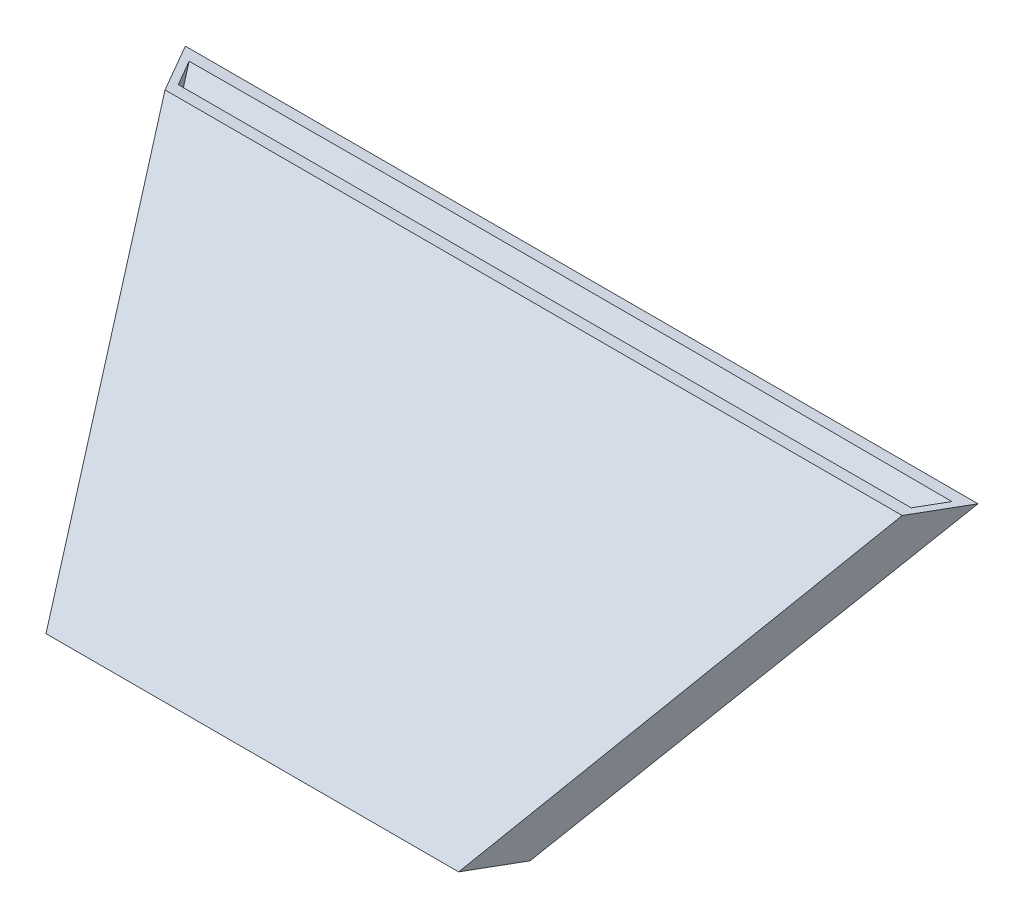
ISO-10303-21;
HEADER;
FILE_DESCRIPTION(('STEP AP214'),'2;1');
FILE_NAME('part.step','',(''),(''),'','','');
FILE_SCHEMA(('AUTOMOTIVE_DESIGN { 1 0 10303 214 1 1 1 1 }'));
ENDSEC;
DATA;
#1=APPLICATION_CONTEXT('core data for automotive mechanical design processes');
#2=APPLICATION_PROTOCOL_DEFINITION('international standard','automotive_design',2000,#1);
#3=PRODUCT_CONTEXT('',#1,'mechanical');
#4=PRODUCT('Part','Part','',(#3));
#5=PRODUCT_RELATED_PRODUCT_CATEGORY('part','',(#4));
#6=PRODUCT_DEFINITION_FORMATION('','',#4);
#7=PRODUCT_DEFINITION_CONTEXT('part definition',#1,'design');
#8=PRODUCT_DEFINITION('design','',#6,#7);
#9=PRODUCT_DEFINITION_SHAPE('','',#8);
#10=(LENGTH_UNIT() NAMED_UNIT(*) SI_UNIT(.MILLI.,.METRE.));
#11=(NAMED_UNIT(*) PLANE_ANGLE_UNIT() SI_UNIT($,.RADIAN.));
#12=(NAMED_UNIT(*) SI_UNIT($,.STERADIAN.) SOLID_ANGLE_UNIT());
#13=UNCERTAINTY_MEASURE_WITH_UNIT(LENGTH_MEASURE(1.E-05),#10,'distance_accuracy_value','');
#14=(GEOMETRIC_REPRESENTATION_CONTEXT(3) GLOBAL_UNCERTAINTY_ASSIGNED_CONTEXT((#13)) GLOBAL_UNIT_ASSIGNED_CONTEXT((#10,
#11,#12)) REPRESENTATION_CONTEXT('',''));
#15=CARTESIAN_POINT('',(0.,0.,0.));
#16=DIRECTION('',(0.,0.,1.));
#17=DIRECTION('',(1.,0.,0.));
#18=AXIS2_PLACEMENT_3D('',#15,#16,#17);
#19=CARTESIAN_POINT('',(0.,336.67,0.));
#20=DIRECTION('',(0.,-1.,0.));
#21=DIRECTION('',(0.,0.,-1.));
#22=AXIS2_PLACEMENT_3D('',#19,#20,#21);
#23=PLANE('',#22);
#24=DIRECTION('',(0.5,0.,0.866025403784439));
#25=VECTOR('',#24,1.);
#26=CARTESIAN_POINT('',(-812.185,336.67,-318.914360830776));
#27=LINE('',#26,#25);
#28=CARTESIAN_POINT('',(-849.685,336.67,-383.866266114609));
#29=VERTEX_POINT('',#28);
#30=CARTESIAN_POINT('',(-812.185,336.67,-318.914360830776));
#31=VERTEX_POINT('',#30);
#32=EDGE_CURVE('E195',#29,#31,#27,.T.);
#33=ORIENTED_EDGE('',*,*,#32,.T.);
#34=DIRECTION('',(1.,0.,0.));
#35=VECTOR('',#34,1.);
#36=CARTESIAN_POINT('',(-812.185,336.67,-318.914360830776));
#37=LINE('',#36,#35);
#38=CARTESIAN_POINT('',(183.945,336.67,-318.914360830776));
#39=VERTEX_POINT('',#38);
#40=EDGE_CURVE('E198',#31,#39,#37,.T.);
#41=ORIENTED_EDGE('',*,*,#40,.T.);
#42=DIRECTION('',(0.5,0.,-0.866025403784439));
#43=VECTOR('',#42,1.);
#44=CARTESIAN_POINT('',(221.445,336.67,-383.866266114609));
#45=LINE('',#44,#43);
#46=CARTESIAN_POINT('',(221.445,336.67,-383.866266114609));
#47=VERTEX_POINT('',#46);
#48=EDGE_CURVE('E202',#39,#47,#45,.T.);
#49=ORIENTED_EDGE('',*,*,#48,.T.);
#50=DIRECTION('',(-1.,0.,0.));
#51=VECTOR('',#50,1.);
#52=CARTESIAN_POINT('',(-849.685,336.67,-383.866266114609));
#53=LINE('',#52,#51);
#54=EDGE_CURVE('E238',#47,#29,#53,.T.);
#55=ORIENTED_EDGE('',*,*,#54,.T.);
#56=EDGE_LOOP('',(#33,#41,#49,#55));
#57=FACE_BOUND('',#56,.T.);
#58=DIRECTION('',(0.5,0.,0.866025403784438));
#59=VECTOR('',#58,1.);
#60=CARTESIAN_POINT('',(-462.384525975255,336.67,266.957830540931));
#61=LINE('',#60,#59);
#62=CARTESIAN_POINT('',(-829.434203941642,336.67,-368.790860598645));
#63=VERTEX_POINT('',#62);
#64=CARTESIAN_POINT('',(-809.345411093207,336.67,-333.99605072243));
#65=VERTEX_POINT('',#64);
#66=EDGE_CURVE('E381',#63,#65,#61,.T.);
#67=ORIENTED_EDGE('',*,*,#66,.F.);
#68=CARTESIAN_POINT('',(201.194203941642,336.67,-368.790860598645));
#69=CARTESIAN_POINT('',(177.767622527672,336.67,-368.927560260811));
#70=CARTESIAN_POINT('',(154.340988191036,336.67,-369.055227186869));
#71=CARTESIAN_POINT('',(107.48762626407,336.67,-369.292150354651));
#72=CARTESIAN_POINT('',(84.0608986737395,336.67,-369.401406596216));
#73=CARTESIAN_POINT('',(37.2073662340033,336.67,-369.601163167737));
#74=CARTESIAN_POINT('',(13.7805613846082,336.67,-369.691663500094));
#75=CARTESIAN_POINT('',(-33.0731126815192,336.67,-369.853826659134));
#76=CARTESIAN_POINT('',(-56.4999818982513,336.67,-369.925489485847));
#77=CARTESIAN_POINT('',(-126.780666880352,336.67,-370.112247978965));
#78=CARTESIAN_POINT('',(-173.634562051957,336.67,-370.199113667192));
#79=CARTESIAN_POINT('',(-243.915459219402,336.67,-370.273490536471));
#80=CARTESIAN_POINT('',(-267.342436137663,336.67,-370.28896254792));
#81=CARTESIAN_POINT('',(-314.196396276341,336.67,-370.301316174199));
#82=CARTESIAN_POINT('',(-337.623379496757,336.67,-370.298197788283));
#83=CARTESIAN_POINT('',(-400.082568879104,336.67,-370.265095742492));
#84=CARTESIAN_POINT('',(-439.114767294266,336.67,-370.218600212694));
#85=CARTESIAN_POINT('',(-517.179071623277,336.67,-370.073607070972));
#86=CARTESIAN_POINT('',(-556.211177537117,336.67,-369.975109454431));
#87=CARTESIAN_POINT('',(-614.759221727425,336.67,-369.788113179925));
#88=CARTESIAN_POINT('',(-634.275224432825,336.67,-369.719239414662));
#89=CARTESIAN_POINT('',(-673.307179853951,336.67,-369.568445320019));
#90=CARTESIAN_POINT('',(-692.823132569676,336.67,-369.486524990566));
#91=CARTESIAN_POINT('',(-731.854977619463,336.67,-369.309720051469));
#92=CARTESIAN_POINT('',(-751.37086995353,336.67,-369.214835442835));
#93=CARTESIAN_POINT('',(-790.402588367779,336.67,-369.012336587714));
#94=CARTESIAN_POINT('',(-809.918414447963,336.67,-368.904722341381));
#95=CARTESIAN_POINT('',(-829.434203941642,336.67,-368.790860598645));
#96=B_SPLINE_CURVE_WITH_KNOTS('',3,(#68,#69,#70,#71,#72,#73,#74,#75,#76,#77,#78,#79,#80,#81,#82,
#83,#84,#85,#86,#87,#88,#89,#90,#91,#92,#93,#94,#95),.UNSPECIFIED.,.F.,.F.,(4,2,2,2,2,2,2,2,2,2,
2,2,2,4),(0.,70.2809392750129,140.56187915507,210.842810036164,281.123740803581,421.68559611537,
491.966536535892,562.2474797771,679.344122455269,796.440775530799,854.989144601206,
913.537513996576,972.085878827586,1030.63424294677),.UNSPECIFIED.);
#97=CARTESIAN_POINT('',(201.194203941642,336.67,-368.790860598645));
#98=VERTEX_POINT('',#97);
#99=EDGE_CURVE('E132',#98,#63,#96,.T.);
#100=ORIENTED_EDGE('',*,*,#99,.F.);
#101=DIRECTION('',(0.5,0.,-0.866025403784438));
#102=VECTOR('',#101,1.);
#103=CARTESIAN_POINT('',(-8.79547402474481,336.67,-5.07806929583678));
#104=LINE('',#103,#102);
#105=CARTESIAN_POINT('',(181.105411093207,336.67,-333.99605072243));
#106=VERTEX_POINT('',#105);
#107=EDGE_CURVE('E380',#106,#98,#104,.T.);
#108=ORIENTED_EDGE('',*,*,#107,.F.);
#109=DIRECTION('',(1.,0.,0.));
#110=VECTOR('',#109,1.);
#111=CARTESIAN_POINT('',(0.,336.67,-333.99605072243));
#112=LINE('',#111,#110);
#113=EDGE_CURVE('E133',#65,#106,#112,.T.);
#114=ORIENTED_EDGE('',*,*,#113,.F.);
#115=EDGE_LOOP('',(#67,#100,#108,#114));
#116=FACE_BOUND('',#115,.T.);
#117=ADVANCED_FACE('F50',(#57,#116),#23,.F.);
#118=CARTESIAN_POINT('',(-314.12,0.,619.065639169224));
#119=DIRECTION('',(0.,1.,0.));
#120=DIRECTION('',(0.,0.,1.));
#121=AXIS2_PLACEMENT_3D('',#118,#119,#120);
#122=PLANE('',#121);
#123=DIRECTION('',(0.5,0.,-0.866025403784438));
#124=VECTOR('',#123,1.);
#125=CARTESIAN_POINT('',(-355.25354003448,0.,595.317178757595));
#126=LINE('',#125,#124);
#127=CARTESIAN_POINT('',(-38.1595889067927,0.,46.0943446316787));
#128=VERTEX_POINT('',#127);
#129=CARTESIAN_POINT('',(-17.1460683511006,0.,9.69785938332696));
#130=VERTEX_POINT('',#129);
#131=EDGE_CURVE('E136',#128,#130,#126,.T.);
#132=ORIENTED_EDGE('',*,*,#131,.T.);
#133=CARTESIAN_POINT('',(-17.1460683511006,0.,9.69785938332696));
#134=CARTESIAN_POINT('',(-22.5959345549177,0.,6.91446475709525));
#135=CARTESIAN_POINT('',(-28.08520646531,0.,4.20833848070663));
#136=CARTESIAN_POINT('',(-39.1377001956092,0.,-1.04735906517468));
#137=CARTESIAN_POINT('',(-44.7009165653222,0.,-3.59694179596975));
#138=CARTESIAN_POINT('',(-55.8969425284475,0.,-8.53781214612076));
#139=CARTESIAN_POINT('',(-61.5297484333102,0.,-10.9291081130142));
#140=CARTESIAN_POINT('',(-70.0277258618618,0.,-14.3957770906997));
#141=CARTESIAN_POINT('',(-72.8685008168732,0.,-15.5312829776681));
#142=CARTESIAN_POINT('',(-78.5658425406811,0.,-17.7619609461049));
#143=CARTESIAN_POINT('',(-81.4224093106047,0.,-18.8571330246944));
#144=CARTESIAN_POINT('',(-90.0147625720901,0.,-22.0819476816425));
#145=CARTESIAN_POINT('',(-95.7734291646743,0.,-24.1509813294373));
#146=CARTESIAN_POINT('',(-107.346715300891,0.,-28.1258382717863));
#147=CARTESIAN_POINT('',(-113.161334786217,0.,-30.0316617363938));
#148=CARTESIAN_POINT('',(-124.836610971547,0.,-33.6769718630674));
#149=CARTESIAN_POINT('',(-130.697220200837,0.,-35.4166105012768));
#150=CARTESIAN_POINT('',(-142.465003556135,0.,-38.7305363227231));
#151=CARTESIAN_POINT('',(-148.372177739316,0.,-40.304823302909));
#152=CARTESIAN_POINT('',(-160.228442035433,0.,-43.286758583143));
#153=CARTESIAN_POINT('',(-166.177532192732,0.,-44.6944067067977));
#154=CARTESIAN_POINT('',(-178.112840227048,0.,-47.3423596600115));
#155=CARTESIAN_POINT('',(-184.099058093284,0.,-48.5826645381618));
#156=CARTESIAN_POINT('',(-196.10387832942,0.,-50.8948987347913));
#157=CARTESIAN_POINT('',(-202.122480567271,0.,-51.966828739292));
#158=CARTESIAN_POINT('',(-214.187333246482,0.,-53.9418022987353));
#159=CARTESIAN_POINT('',(-220.233583375859,0.,-54.8448477546089));
#160=CARTESIAN_POINT('',(-229.927212182593,0.,-56.154273862367));
#161=CARTESIAN_POINT('',(-233.567353123389,0.,-56.6148899702799));
#162=CARTESIAN_POINT('',(-240.854901556854,0.,-57.4749098113412));
#163=CARTESIAN_POINT('',(-244.502309086763,0.,-57.8743132299659));
#164=CARTESIAN_POINT('',(-251.803321011183,0.,-58.6118791558135));
#165=CARTESIAN_POINT('',(-255.456925417777,0.,-58.9500415434858));
#166=CARTESIAN_POINT('',(-262.769248516998,0.,-59.5650481879773));
#167=CARTESIAN_POINT('',(-266.427967201953,0.,-59.8418925366685));
#168=CARTESIAN_POINT('',(-277.410384718215,0.,-60.5802444989461));
#169=CARTESIAN_POINT('',(-284.740500546809,0.,-60.9495867434485));
#170=CARTESIAN_POINT('',(-299.409002806994,0.,-61.4424323140075));
#171=CARTESIAN_POINT('',(-306.747389414027,0.,-61.5659303230526));
#172=CARTESIAN_POINT('',(-321.424391525608,0.,-61.5666951912937));
#173=CARTESIAN_POINT('',(-328.763007030538,0.,-61.4439548043461));
#174=CARTESIAN_POINT('',(-343.428616925756,0.,-60.9527226905418));
#175=CARTESIAN_POINT('',(-350.755615211304,0.,-60.5843493804904));
#176=CARTESIAN_POINT('',(-361.733440095958,0.,-59.8476048461677));
#177=CARTESIAN_POINT('',(-365.390667579713,0.,-59.57131938692));
#178=CARTESIAN_POINT('',(-372.700017491556,0.,-58.9574810436383));
#179=CARTESIAN_POINT('',(-376.352139918283,0.,-58.6199281432803));
#180=CARTESIAN_POINT('',(-383.650057167611,0.,-57.8836461768688));
#181=CARTESIAN_POINT('',(-387.295852234254,0.,-57.4849195257866));
#182=CARTESIAN_POINT('',(-394.58023423233,0.,-56.6263051163144));
#183=CARTESIAN_POINT('',(-398.218821167692,0.,-56.1664173912852));
#184=CARTESIAN_POINT('',(-405.487475339594,0.,-55.1856446343803));
#185=CARTESIAN_POINT('',(-409.117543219243,0.,-54.6647643685453));
#186=CARTESIAN_POINT('',(-416.368427907923,0.,-53.5621428792774));
#187=CARTESIAN_POINT('',(-419.98924470149,0.,-52.9804015541819));
#188=CARTESIAN_POINT('',(-427.220201853812,0.,-51.7562403416297));
#189=CARTESIAN_POINT('',(-430.830343355902,0.,-51.1138272142984));
#190=CARTESIAN_POINT('',(-438.039251639207,0.,-49.7683662534019));
#191=CARTESIAN_POINT('',(-441.638018488757,0.,-49.065318784825));
#192=CARTESIAN_POINT('',(-450.988204956945,0.,-47.1569247695161));
#193=CARTESIAN_POINT('',(-456.730055253023,0.,-45.9041801461838));
#194=CARTESIAN_POINT('',(-465.315450153069,0.,-43.9093765575304));
#195=CARTESIAN_POINT('',(-468.172587368855,0.,-43.2251864044171));
#196=CARTESIAN_POINT('',(-473.877369914811,0.,-41.8182782644751));
#197=CARTESIAN_POINT('',(-476.725015233826,0.,-41.0955602323842));
#198=CARTESIAN_POINT('',(-485.252484746578,0.,-38.8699242392712));
#199=CARTESIAN_POINT('',(-490.91738490881,0.,-37.3093983554834));
#200=CARTESIAN_POINT('',(-502.202608435763,0.,-34.0359618578261));
#201=CARTESIAN_POINT('',(-507.822933997201,0.,-32.3230588048438));
#202=CARTESIAN_POINT('',(-519.015002675124,0.,-28.745747016958));
#203=CARTESIAN_POINT('',(-524.586747029259,0.,-26.8813421542632));
#204=CARTESIAN_POINT('',(-535.677470049641,0.,-23.0024780909464));
#205=CARTESIAN_POINT('',(-541.196451790307,0.,-20.9880276941901));
#206=CARTESIAN_POINT('',(-549.43234173794,0.,-17.8546488702972));
#207=CARTESIAN_POINT('',(-552.170605656876,0.,-16.79154554309));
#208=CARTESIAN_POINT('',(-557.632429012831,0.,-14.6282141166534));
#209=CARTESIAN_POINT('',(-560.355988449615,0.,-13.5279860168299));
#210=CARTESIAN_POINT('',(-568.504184848367,0.,-10.1718786246856));
#211=CARTESIAN_POINT('',(-573.90614367488,0.,-7.86065089863976));
#212=CARTESIAN_POINT('',(-584.645814811389,0.,-3.09230805861351));
#213=CARTESIAN_POINT('',(-589.983521019854,0.,-0.635179219040813));
#214=CARTESIAN_POINT('',(-600.590914790585,0.,4.42348924505039));
#215=CARTESIAN_POINT('',(-605.860593357967,0.,7.02504773039029));
#216=CARTESIAN_POINT('',(-611.0939316489,0.,9.69785938332692));
#217=B_SPLINE_CURVE_WITH_KNOTS('',3,(#133,#134,#135,#136,#137,#138,#139,#140,#141,#142,#143,
#144,#145,#146,#147,#148,#149,#150,#151,#152,#153,#154,#155,#156,#157,#158,#159,#160,#161,#162,
#163,#164,#165,#166,#167,#168,#169,#170,#171,#172,#173,#174,#175,#176,#177,#178,#179,#180,#181,
#182,#183,#184,#185,#186,#187,#188,#189,#190,#191,#192,#193,#194,#195,#196,#197,#198,#199,#200,
#201,#202,#203,#204,#205,#206,#207,#208,#209,#210,#211,#212,#213,#214,#215,#216),.UNSPECIFIED.,
.F.,.F.,(4,2,2,2,2,2,2,2,2,2,2,2,2,2,2,2,2,2,2,2,2,2,2,2,2,2,2,2,2,2,2,2,2,2,2,2,2,2,2,2,2,4),
(0.,18.3578001638368,36.7142546585893,55.0697403201261,64.2474044612167,73.4250692573991,
91.7796631644887,110.134237947168,128.471863464619,146.809511500319,165.147178946917,
183.484841068833,201.822428474399,220.159809463276,231.16685665836,242.173960408057,
253.181085644858,264.188194389749,286.201943133871,308.216167976534,330.231040649007,
352.235307870443,363.237830929448,374.240356919954,385.24244867272,396.244534424305,
407.245761030835,418.247006014177,429.247026668421,440.246981112683,457.875252984094,
466.688783526984,475.502324424176,493.127736190001,510.752273878042,528.376361245146,
545.999415338865,554.811360004501,563.623304811144,581.247824054875,598.874003953547,
616.502491064252),.UNSPECIFIED.);
#218=CARTESIAN_POINT('',(-611.093931648899,0.,9.69785938332692));
#219=VERTEX_POINT('',#218);
#220=EDGE_CURVE('E127',#130,#219,#217,.T.);
#221=ORIENTED_EDGE('',*,*,#220,.T.);
#222=DIRECTION('',(0.5,0.,0.866025403784438));
#223=VECTOR('',#222,1.);
#224=CARTESIAN_POINT('',(-272.98645996552,0.,595.317178757595));
#225=LINE('',#224,#223);
#226=CARTESIAN_POINT('',(-590.080411093207,0.,46.0943446316787));
#227=VERTEX_POINT('',#226);
#228=EDGE_CURVE('E118',#219,#227,#225,.T.);
#229=ORIENTED_EDGE('',*,*,#228,.T.);
#230=DIRECTION('',(1.,0.,0.));
#231=VECTOR('',#230,1.);
#232=CARTESIAN_POINT('',(-314.12,0.,46.0943446316787));
#233=LINE('',#232,#231);
#234=EDGE_CURVE('E126',#227,#128,#233,.T.);
#235=ORIENTED_EDGE('',*,*,#234,.T.);
#236=EDGE_LOOP('',(#132,#221,#229,#235));
#237=FACE_BOUND('',#236,.T.);
#238=CARTESIAN_POINT('',(-314.12,0.,619.065639169224));
#239=DIRECTION('',(0.,1.,0.));
#240=DIRECTION('',(0.,0.,1.));
#241=AXIS2_PLACEMENT_3D('',#238,#239,#240);
#242=CIRCLE('',#241,694.2);
#243=CARTESIAN_POINT('',(0.,0.,0.));
#244=VERTEX_POINT('',#243);
#245=CARTESIAN_POINT('',(-628.24,0.,0.));
#246=VERTEX_POINT('',#245);
#247=EDGE_CURVE('E257',#244,#246,#242,.T.);
#248=ORIENTED_EDGE('',*,*,#247,.F.);
#249=DIRECTION('',(0.5,0.,-0.866025403784438));
#250=VECTOR('',#249,1.);
#251=CARTESIAN_POINT('',(-35.32,0.,61.1760345233327));
#252=LINE('',#251,#250);
#253=CARTESIAN_POINT('',(-35.32,0.,61.1760345233327));
#254=VERTEX_POINT('',#253);
#255=EDGE_CURVE('E12',#254,#244,#252,.T.);
#256=ORIENTED_EDGE('',*,*,#255,.F.);
#257=DIRECTION('',(1.,0.,0.));
#258=VECTOR('',#257,1.);
#259=CARTESIAN_POINT('',(-592.92,0.,61.1760345233327));
#260=LINE('',#259,#258);
#261=CARTESIAN_POINT('',(-592.92,0.,61.1760345233327));
#262=VERTEX_POINT('',#261);
#263=EDGE_CURVE('E61',#262,#254,#260,.T.);
#264=ORIENTED_EDGE('',*,*,#263,.F.);
#265=DIRECTION('',(0.5,0.,0.866025403784438));
#266=VECTOR('',#265,1.);
#267=CARTESIAN_POINT('',(-592.92,0.,61.1760345233327));
#268=LINE('',#267,#266);
#269=EDGE_CURVE('E278',#246,#262,#268,.T.);
#270=ORIENTED_EDGE('',*,*,#269,.F.);
#271=EDGE_LOOP('',(#248,#256,#264,#270));
#272=FACE_BOUND('',#271,.T.);
#273=ADVANCED_FACE('F52',(#237,#272),#122,.F.);
#274=CARTESIAN_POINT('',(-471.179898657305,0.252324237967699,272.035841326536));
#275=DIRECTION('',(-0.866025310650866,0.000463770159112096,0.499999946229307));
#276=DIRECTION('',(0.5,0.,0.866025403784438));
#277=AXIS2_PLACEMENT_3D('',#274,#275,#276);
#278=PLANE('',#277);
#279=DIRECTION('',(0.397895211861508,-0.604932967452025,0.689735822809989));
#280=VECTOR('',#279,1.);
#281=CARTESIAN_POINT('',(-849.685,336.67,-383.866266114609));
#282=LINE('',#281,#280);
#283=EDGE_CURVE('E201',#29,#246,#282,.T.);
#284=ORIENTED_EDGE('',*,*,#283,.T.);
#285=ORIENTED_EDGE('',*,*,#269,.T.);
#286=DIRECTION('',(0.396446759227224,-0.608723373219754,0.687230545009603));
#287=VECTOR('',#286,1.);
#288=CARTESIAN_POINT('',(-812.185,336.67,-318.914360830776));
#289=LINE('',#288,#287);
#290=EDGE_CURVE('E292',#31,#262,#289,.T.);
#291=ORIENTED_EDGE('',*,*,#290,.F.);
#292=ORIENTED_EDGE('',*,*,#32,.F.);
#293=EDGE_LOOP('',(#284,#285,#291,#292));
#294=FACE_BOUND('',#293,.T.);
#295=ADVANCED_FACE('F223',(#294),#278,.T.);
#296=CARTESIAN_POINT('',(0.,30.3643357843529,26.8956044495524));
#297=DIRECTION('',(0.,0.748570088979865,0.663055670275639));
#298=DIRECTION('',(0.,-0.663055670275639,0.748570088979865));
#299=AXIS2_PLACEMENT_3D('',#296,#297,#298);
#300=PLANE('',#299);
#301=ORIENTED_EDGE('',*,*,#290,.T.);
#302=ORIENTED_EDGE('',*,*,#263,.T.);
#303=DIRECTION('',(-0.396446759227224,-0.608723373219754,0.687230545009603));
#304=VECTOR('',#303,1.);
#305=CARTESIAN_POINT('',(183.945,336.67,-318.914360830776));
#306=LINE('',#305,#304);
#307=EDGE_CURVE('E286',#39,#254,#306,.T.);
#308=ORIENTED_EDGE('',*,*,#307,.F.);
#309=ORIENTED_EDGE('',*,*,#40,.F.);
#310=EDGE_LOOP('',(#301,#302,#308,#309));
#311=FACE_BOUND('',#310,.T.);
#312=ADVANCED_FACE('F170',(#311),#300,.T.);
#313=CARTESIAN_POINT('',(-849.685,336.67,-383.866266114609));
#314=CARTESIAN_POINT('',(-628.24,0.,0.));
#315=CARTESIAN_POINT('',(-621.706930619844,-9.93243680470077,11.3248208323872));
#316=CARTESIAN_POINT('',(-805.054583333333,336.67,-383.866266114609));
#317=CARTESIAN_POINT('',(-604.896475250188,0.,-11.8447342744646));
#318=CARTESIAN_POINT('',(-598.99141165829,-9.93243680470077,-0.869356738627713));
#319=CARTESIAN_POINT('',(-760.424166666667,336.67,-383.866266114609));
#320=CARTESIAN_POINT('',(-580.562582168186,0.,-22.5267890938935));
#321=CARTESIAN_POINT('',(-575.256306522526,-9.93243680470077,-11.8665534906266));
#322=CARTESIAN_POINT('',(-693.478541666667,336.67,-383.866266114609));
#323=CARTESIAN_POINT('',(-542.853219947177,0.,-36.5062237808645));
#324=CARTESIAN_POINT('',(-538.409472392698,-9.93243680470077,-26.2584093959829));
#325=CARTESIAN_POINT('',(-671.163333333333,336.67,-383.866266114609));
#326=CARTESIAN_POINT('',(-530.082882016787,0.,-40.8259130593455));
#327=CARTESIAN_POINT('',(-525.920727185409,-9.93243680470077,-30.7055381278588));
#328=CARTESIAN_POINT('',(-626.532916666667,336.67,-383.866266114609));
#329=CARTESIAN_POINT('',(-504.197018073212,0.,-48.7423828790467));
#330=CARTESIAN_POINT('',(-500.58786495079,-9.93243680470077,-38.8555596040797));
#331=CARTESIAN_POINT('',(-604.217708333333,336.67,-383.866266114609));
#332=CARTESIAN_POINT('',(-491.081518074017,0.,-52.3391313127458));
#333=CARTESIAN_POINT('',(-487.743774704916,-9.93243680470077,-42.5584192936677));
#334=CARTESIAN_POINT('',(-559.587291666667,336.67,-383.866266114609));
#335=CARTESIAN_POINT('',(-464.566957815423,0.,-58.7731747010732));
#336=CARTESIAN_POINT('',(-461.76366835946,-9.93243680470077,-49.1822798006968));
#337=CARTESIAN_POINT('',(-537.272083333333,336.67,-383.866266114609));
#338=CARTESIAN_POINT('',(-451.167929540433,0.,-61.6104419542508));
#339=CARTESIAN_POINT('',(-448.627685187892,-9.93243680470077,-52.1032520994389));
#340=CARTESIAN_POINT('',(-492.641666666667,336.67,-383.866266114609));
#341=CARTESIAN_POINT('',(-424.152743919965,0.,-66.4960704312862));
#342=CARTESIAN_POINT('',(-422.132184033418,-9.93243680470077,-57.1330163655241));
#343=CARTESIAN_POINT('',(-470.326458333333,336.67,-383.866266114609));
#344=CARTESIAN_POINT('',(-410.536623624383,0.,-68.5444096259611));
#345=CARTESIAN_POINT('',(-408.772704193456,-9.93243680470077,-59.2417856537794));
#346=CARTESIAN_POINT('',(-425.696041666667,336.67,-383.866266114609));
#347=CARTESIAN_POINT('',(-383.157449142034,0.,-71.8305723786494));
#348=CARTESIAN_POINT('',(-381.902475779359,-9.93243680470077,-62.6248967650118));
#349=CARTESIAN_POINT('',(-403.380833333333,336.67,-383.866266114609));
#350=CARTESIAN_POINT('',(-369.394435865343,0.,-73.0683806245189));
#351=CARTESIAN_POINT('',(-368.391769322229,-9.93243680470077,-63.8992228241062));
#352=CARTESIAN_POINT('',(-358.750416666667,336.67,-383.866266114609));
#353=CARTESIAN_POINT('',(-341.794260199084,0.,-74.7202787755774));
#354=CARTESIAN_POINT('',(-341.294019748301,-9.93243680470077,-65.5998552668841));
#355=CARTESIAN_POINT('',(-336.435208333333,336.67,-383.866266114609));
#356=CARTESIAN_POINT('',(-327.957141137337,0.,-75.1343608307758));
#357=CARTESIAN_POINT('',(-327.707021237583,-9.93243680470077,-66.0261535689867));
#358=CARTESIAN_POINT('',(-291.804791666667,336.67,-383.866266114609));
#359=CARTESIAN_POINT('',(-300.282858862663,0.,-75.1343608307758));
#360=CARTESIAN_POINT('',(-300.532978762417,-9.93243680470077,-66.0261535689867));
#361=CARTESIAN_POINT('',(-269.489583333333,336.67,-383.866266114609));
#362=CARTESIAN_POINT('',(-286.445739800916,0.,-74.7202787755773));
#363=CARTESIAN_POINT('',(-286.945980251698,-9.93243680470077,-65.5998552668841));
#364=CARTESIAN_POINT('',(-224.859166666667,336.67,-383.866266114609));
#365=CARTESIAN_POINT('',(-258.845564134656,0.,-73.0683806245188));
#366=CARTESIAN_POINT('',(-259.84823067777,-9.93243680470077,-63.8992228241061));
#367=CARTESIAN_POINT('',(-202.543958333333,336.67,-383.866266114609));
#368=CARTESIAN_POINT('',(-245.082550857966,0.,-71.8305723786494));
#369=CARTESIAN_POINT('',(-246.337524220641,-9.93243680470077,-62.6248967650117));
#370=CARTESIAN_POINT('',(-157.913541666667,336.67,-383.866266114609));
#371=CARTESIAN_POINT('',(-217.703376375617,0.,-68.5444096259611));
#372=CARTESIAN_POINT('',(-219.467295806544,-9.93243680470077,-59.2417856537793));
#373=CARTESIAN_POINT('',(-135.598333333333,336.67,-383.866266114609));
#374=CARTESIAN_POINT('',(-204.087256080035,0.,-66.4960704312862));
#375=CARTESIAN_POINT('',(-206.107815966582,-9.93243680470077,-57.1330163655241));
#376=CARTESIAN_POINT('',(-90.9679166666667,336.67,-383.866266114609));
#377=CARTESIAN_POINT('',(-177.072070459567,0.,-61.6104419542507));
#378=CARTESIAN_POINT('',(-179.612314812108,-9.93243680470077,-52.1032520994389));
#379=CARTESIAN_POINT('',(-68.6527083333333,336.67,-383.866266114609));
#380=CARTESIAN_POINT('',(-163.673042184577,0.,-58.7731747010732));
#381=CARTESIAN_POINT('',(-166.47633164054,-9.93243680470077,-49.1822798006967));
#382=CARTESIAN_POINT('',(-24.0222916666667,336.67,-383.866266114609));
#383=CARTESIAN_POINT('',(-137.158481925983,0.,-52.3391313127457));
#384=CARTESIAN_POINT('',(-140.496225295084,-9.93243680470077,-42.5584192936676));
#385=CARTESIAN_POINT('',(-1.70708333333335,336.67,-383.866266114609));
#386=CARTESIAN_POINT('',(-124.042981926788,0.,-48.7423828790466));
#387=CARTESIAN_POINT('',(-127.65213504921,-9.93243680470077,-38.8555596040796));
#388=CARTESIAN_POINT('',(42.9233333333333,336.67,-383.866266114609));
#389=CARTESIAN_POINT('',(-98.1571179832126,0.,-40.8259130593454));
#390=CARTESIAN_POINT('',(-102.319272814591,-9.93243680470077,-30.7055381278587));
#391=CARTESIAN_POINT('',(65.2385416666666,336.67,-383.866266114609));
#392=CARTESIAN_POINT('',(-85.3867800528225,0.,-36.5062237808644));
#393=CARTESIAN_POINT('',(-89.8305276073019,-9.93243680470077,-26.2584093959828));
#394=CARTESIAN_POINT('',(132.184166666667,336.67,-383.866266114609));
#395=CARTESIAN_POINT('',(-47.6774178318136,0.,-22.5267890938934));
#396=CARTESIAN_POINT('',(-52.9836934774741,-9.93243680470077,-11.8665534906265));
#397=CARTESIAN_POINT('',(176.814583333333,336.67,-383.866266114609));
#398=CARTESIAN_POINT('',(-23.3435247498122,0.,-11.8447342744645));
#399=CARTESIAN_POINT('',(-29.2485883417102,-9.93243680470077,-0.869356738627581));
#400=CARTESIAN_POINT('',(221.445,336.67,-383.866266114609));
#401=CARTESIAN_POINT('',(1.11022302462516E-13,0.,1.11022302462516E-13));
#402=CARTESIAN_POINT('',(-6.53306938015541,-9.93243680470077,11.3248208323873));
#403=B_SPLINE_SURFACE_WITH_KNOTS('',3,1,((#313,#314,#315),(#316,#317,#318),(#319,#320,#321),
(#322,#323,#324),(#325,#326,#327),(#328,#329,#330),(#331,#332,#333),(#334,#335,#336),(#337,#338,
#339),(#340,#341,#342),(#343,#344,#345),(#346,#347,#348),(#349,#350,#351),(#352,#353,#354),
(#355,#356,#357),(#358,#359,#360),(#361,#362,#363),(#364,#365,#366),(#367,#368,#369),(#370,#371,
#372),(#373,#374,#375),(#376,#377,#378),(#379,#380,#381),(#382,#383,#384),(#385,#386,#387),
(#388,#389,#390),(#391,#392,#393),(#394,#395,#396),(#397,#398,#399),(#400,#401,#402)),
.UNSPECIFIED.,.F.,.F.,.F.,(4,2,2,2,2,2,2,2,2,2,2,2,2,2,4),(2,1,2),(0.,0.125,0.1875,0.25,0.3125,
0.375,0.4375,0.5,0.5625,0.625,0.6875,0.75,0.8125,0.875,1.),(0.,1.,1.02950199543975),.UNSPECIFIED.);
#404=DIRECTION('',(-0.397895211861507,-0.604932967452025,0.689735822809989));
#405=VECTOR('',#404,1.);
#406=CARTESIAN_POINT('',(110.7225,168.335,-191.933133057304));
#407=LINE('',#406,#405);
#408=EDGE_CURVE('E288',#47,#244,#407,.T.);
#409=ORIENTED_EDGE('',*,*,#54,.F.);
#410=ORIENTED_EDGE('',*,*,#408,.T.);
#411=ORIENTED_EDGE('',*,*,#247,.T.);
#412=ORIENTED_EDGE('',*,*,#283,.F.);
#413=EDGE_LOOP('',(#409,#410,#411,#412));
#414=FACE_BOUND('',#413,.T.);
#415=ADVANCED_FACE('F163',(#414),#403,.T.);
#416=CARTESIAN_POINT('',(0.,0.,0.));
#417=DIRECTION('',(0.866025310650866,0.000463770159112333,0.499999946229307));
#418=DIRECTION('',(0.5,0.,-0.866025403784438));
#419=AXIS2_PLACEMENT_3D('',#416,#417,#418);
#420=PLANE('',#419);
#421=ORIENTED_EDGE('',*,*,#307,.T.);
#422=ORIENTED_EDGE('',*,*,#255,.T.);
#423=ORIENTED_EDGE('',*,*,#408,.F.);
#424=ORIENTED_EDGE('',*,*,#48,.F.);
#425=EDGE_LOOP('',(#421,#422,#423,#424));
#426=FACE_BOUND('',#425,.T.);
#427=ADVANCED_FACE('F169',(#426),#420,.T.);
#428=CARTESIAN_POINT('',(-462.519645550796,0.247686536376578,267.035841864243));
#429=DIRECTION('',(-0.866025310650866,0.000463770159112096,0.499999946229307));
#430=DIRECTION('',(0.5,0.,0.866025403784438));
#431=AXIS2_PLACEMENT_3D('',#428,#429,#430);
#432=PLANE('',#431);
#433=CARTESIAN_POINT('',(-829.434203941643,336.67,-368.790860598645));
#434=CARTESIAN_POINT('',(-820.14944675176,322.402242597132,-352.695955488164));
#435=CARTESIAN_POINT('',(-810.865887906102,308.131367605084,-336.603123079074));
#436=CARTESIAN_POINT('',(-792.301392528772,279.582797327487,-304.421993915852));
#437=CARTESIAN_POINT('',(-783.02045599726,265.30510204152,-288.333697161999));
#438=CARTESIAN_POINT('',(-755.181920434221,222.460911332462,-240.076199439944));
#439=CARTESIAN_POINT('',(-736.628595019939,193.883310421723,-207.914390293156));
#440=CARTESIAN_POINT('',(-709.15953002199,151.531845285437,-160.297291384624));
#441=CARTESIAN_POINT('',(-700.238644076645,137.771325649727,-144.833100240623));
#442=CARTESIAN_POINT('',(-682.400196197325,110.241674587886,-113.910467321418));
#443=CARTESIAN_POINT('',(-673.482634263305,96.472543161873,-98.4520255461351));
#444=CARTESIAN_POINT('',(-655.651044732891,68.9251219780414,-67.5412551531875));
#445=CARTESIAN_POINT('',(-646.737017137539,55.1468322175307,-52.0889265373221));
#446=CARTESIAN_POINT('',(-628.912660192369,27.5806899659707,-21.1906659849388));
#447=CARTESIAN_POINT('',(-620.002330842714,13.7928374745019,-5.74473404870143));
#448=CARTESIAN_POINT('',(-611.0939316489,0.,9.69785938332702));
#449=B_SPLINE_CURVE_WITH_KNOTS('',3,(#433,#434,#435,#436,#437,#438,#439,#440,#441,#442,#443,
#444,#445,#446,#447,#448),.UNSPECIFIED.,.F.,.F.,(4,2,2,2,2,2,2,4),(0.,70.2808235602702,
140.561651430444,281.123304035279,348.744880124239,416.366455294502,483.988050350286,
551.609648372214),.UNSPECIFIED.);
#450=EDGE_CURVE('E121',#63,#219,#449,.T.);
#451=ORIENTED_EDGE('',*,*,#450,.F.);
#452=ORIENTED_EDGE('',*,*,#66,.T.);
#453=DIRECTION('',(0.396446759227224,-0.608723373219754,0.687230545009603));
#454=VECTOR('',#453,1.);
#455=CARTESIAN_POINT('',(-509.895872523224,-123.119187286417,185.092237438792));
#456=LINE('',#455,#454);
#457=EDGE_CURVE('E69',#65,#227,#456,.T.);
#458=ORIENTED_EDGE('',*,*,#457,.T.);
#459=ORIENTED_EDGE('',*,*,#228,.F.);
#460=EDGE_LOOP('',(#451,#452,#458,#459));
#461=FACE_BOUND('',#460,.T.);
#462=ADVANCED_FACE('F120',(#461),#432,.F.);
#463=CARTESIAN_POINT('',(0.,22.8786348945543,20.265047746796));
#464=DIRECTION('',(0.,0.748570088979865,0.663055670275639));
#465=DIRECTION('',(0.,-0.663055670275639,0.748570088979865));
#466=AXIS2_PLACEMENT_3D('',#463,#464,#465);
#467=PLANE('',#466);
#468=ORIENTED_EDGE('',*,*,#457,.F.);
#469=ORIENTED_EDGE('',*,*,#113,.T.);
#470=DIRECTION('',(-0.396446759227224,-0.608723373219754,0.687230545009603));
#471=VECTOR('',#470,1.);
#472=CARTESIAN_POINT('',(-19.6036260065688,28.4917156391507,13.9280468872951));
#473=LINE('',#472,#471);
#474=EDGE_CURVE('E137',#106,#128,#473,.T.);
#475=ORIENTED_EDGE('',*,*,#474,.T.);
#476=ORIENTED_EDGE('',*,*,#234,.F.);
#477=EDGE_LOOP('',(#468,#469,#475,#476));
#478=FACE_BOUND('',#477,.T.);
#479=ADVANCED_FACE('F157',(#478),#467,.F.);
#480=CARTESIAN_POINT('',(-849.685,336.67,-383.866266114609));
#481=CARTESIAN_POINT('',(-621.706930619844,-9.93243680470077,11.3248208323872));
#482=CARTESIAN_POINT('',(-805.054583333333,336.67,-383.866266114609));
#483=CARTESIAN_POINT('',(-598.99141165829,-9.93243680470077,-0.869356738627713));
#484=CARTESIAN_POINT('',(-760.424166666667,336.67,-383.866266114609));
#485=CARTESIAN_POINT('',(-575.256306522526,-9.93243680470077,-11.8665534906266));
#486=CARTESIAN_POINT('',(-693.478541666667,336.67,-383.866266114609));
#487=CARTESIAN_POINT('',(-538.409472392698,-9.93243680470077,-26.2584093959829));
#488=CARTESIAN_POINT('',(-671.163333333333,336.67,-383.866266114609));
#489=CARTESIAN_POINT('',(-525.920727185409,-9.93243680470077,-30.7055381278588));
#490=CARTESIAN_POINT('',(-626.532916666667,336.67,-383.866266114609));
#491=CARTESIAN_POINT('',(-500.58786495079,-9.93243680470077,-38.8555596040797));
#492=CARTESIAN_POINT('',(-604.217708333333,336.67,-383.866266114609));
#493=CARTESIAN_POINT('',(-487.743774704916,-9.93243680470077,-42.5584192936677));
#494=CARTESIAN_POINT('',(-559.587291666667,336.67,-383.866266114609));
#495=CARTESIAN_POINT('',(-461.76366835946,-9.93243680470077,-49.1822798006968));
#496=CARTESIAN_POINT('',(-537.272083333333,336.67,-383.866266114609));
#497=CARTESIAN_POINT('',(-448.627685187892,-9.93243680470077,-52.1032520994389));
#498=CARTESIAN_POINT('',(-492.641666666667,336.67,-383.866266114609));
#499=CARTESIAN_POINT('',(-422.132184033418,-9.93243680470077,-57.1330163655241));
#500=CARTESIAN_POINT('',(-470.326458333333,336.67,-383.866266114609));
#501=CARTESIAN_POINT('',(-408.772704193456,-9.93243680470077,-59.2417856537794));
#502=CARTESIAN_POINT('',(-425.696041666667,336.67,-383.866266114609));
#503=CARTESIAN_POINT('',(-381.902475779359,-9.93243680470077,-62.6248967650118));
#504=CARTESIAN_POINT('',(-403.380833333333,336.67,-383.866266114609));
#505=CARTESIAN_POINT('',(-368.391769322229,-9.93243680470077,-63.8992228241062));
#506=CARTESIAN_POINT('',(-358.750416666667,336.67,-383.866266114609));
#507=CARTESIAN_POINT('',(-341.294019748301,-9.93243680470077,-65.5998552668841));
#508=CARTESIAN_POINT('',(-336.435208333333,336.67,-383.866266114609));
#509=CARTESIAN_POINT('',(-327.707021237583,-9.93243680470077,-66.0261535689867));
#510=CARTESIAN_POINT('',(-291.804791666667,336.67,-383.866266114609));
#511=CARTESIAN_POINT('',(-300.532978762417,-9.93243680470077,-66.0261535689867));
#512=CARTESIAN_POINT('',(-269.489583333333,336.67,-383.866266114609));
#513=CARTESIAN_POINT('',(-286.945980251698,-9.93243680470077,-65.5998552668841));
#514=CARTESIAN_POINT('',(-224.859166666667,336.67,-383.866266114609));
#515=CARTESIAN_POINT('',(-259.84823067777,-9.93243680470077,-63.8992228241061));
#516=CARTESIAN_POINT('',(-202.543958333333,336.67,-383.866266114609));
#517=CARTESIAN_POINT('',(-246.337524220641,-9.93243680470077,-62.6248967650117));
#518=CARTESIAN_POINT('',(-157.913541666667,336.67,-383.866266114609));
#519=CARTESIAN_POINT('',(-219.467295806544,-9.93243680470077,-59.2417856537793));
#520=CARTESIAN_POINT('',(-135.598333333333,336.67,-383.866266114609));
#521=CARTESIAN_POINT('',(-206.107815966582,-9.93243680470077,-57.1330163655241));
#522=CARTESIAN_POINT('',(-90.9679166666667,336.67,-383.866266114609));
#523=CARTESIAN_POINT('',(-179.612314812108,-9.93243680470077,-52.1032520994389));
#524=CARTESIAN_POINT('',(-68.6527083333333,336.67,-383.866266114609));
#525=CARTESIAN_POINT('',(-166.47633164054,-9.93243680470077,-49.1822798006967));
#526=CARTESIAN_POINT('',(-24.0222916666667,336.67,-383.866266114609));
#527=CARTESIAN_POINT('',(-140.496225295084,-9.93243680470077,-42.5584192936676));
#528=CARTESIAN_POINT('',(-1.70708333333335,336.67,-383.866266114609));
#529=CARTESIAN_POINT('',(-127.65213504921,-9.93243680470077,-38.8555596040796));
#530=CARTESIAN_POINT('',(42.9233333333333,336.67,-383.866266114609));
#531=CARTESIAN_POINT('',(-102.319272814591,-9.93243680470077,-30.7055381278587));
#532=CARTESIAN_POINT('',(65.2385416666666,336.67,-383.866266114609));
#533=CARTESIAN_POINT('',(-89.8305276073019,-9.93243680470077,-26.2584093959828));
#534=CARTESIAN_POINT('',(132.184166666667,336.67,-383.866266114609));
#535=CARTESIAN_POINT('',(-52.9836934774741,-9.93243680470077,-11.8665534906265));
#536=CARTESIAN_POINT('',(176.814583333333,336.67,-383.866266114609));
#537=CARTESIAN_POINT('',(-29.2485883417102,-9.93243680470077,-0.869356738627581));
#538=CARTESIAN_POINT('',(221.445,336.67,-383.866266114609));
#539=CARTESIAN_POINT('',(-6.53306938015541,-9.93243680470077,11.3248208323873));
#540=B_SPLINE_SURFACE_WITH_KNOTS('',3,1,((#480,#481),(#482,#483),(#484,#485),(#486,#487),(#488,
#489),(#490,#491),(#492,#493),(#494,#495),(#496,#497),(#498,#499),(#500,#501),(#502,#503),(#504,
#505),(#506,#507),(#508,#509),(#510,#511),(#512,#513),(#514,#515),(#516,#517),(#518,#519),(#520,
#521),(#522,#523),(#524,#525),(#526,#527),(#528,#529),(#530,#531),(#532,#533),(#534,#535),(#536,
#537),(#538,#539)),.UNSPECIFIED.,.F.,.F.,.F.,(4,2,2,2,2,2,2,2,2,2,2,2,2,2,4),(2,2),(0.,0.125,
0.1875,0.25,0.3125,0.375,0.4375,0.5,0.5625,0.625,0.6875,0.75,0.8125,0.875,1.),(0.,
1.02950199543975),.UNSPECIFIED.);
#541=OFFSET_SURFACE('',#540,-10.,.F.);
#542=ORIENTED_EDGE('',*,*,#99,.T.);
#543=ORIENTED_EDGE('',*,*,#450,.T.);
#544=ORIENTED_EDGE('',*,*,#220,.F.);
#545=CARTESIAN_POINT('',(201.194203941642,336.67,-368.790860598645));
#546=CARTESIAN_POINT('',(191.90944675176,322.402242597132,-352.695955488163));
#547=CARTESIAN_POINT('',(182.625887906102,308.131367605084,-336.603123079074));
#548=CARTESIAN_POINT('',(164.061392528771,279.582797327487,-304.421993915852));
#549=CARTESIAN_POINT('',(154.78045599726,265.30510204152,-288.333697161998));
#550=CARTESIAN_POINT('',(126.94192043422,222.460911332461,-240.076199439943));
#551=CARTESIAN_POINT('',(108.388595019939,193.883310421723,-207.914390293156));
#552=CARTESIAN_POINT('',(80.9195300219907,151.531845285437,-160.297291384623));
#553=CARTESIAN_POINT('',(71.9986440766452,137.771325649726,-144.833100240623));
#554=CARTESIAN_POINT('',(54.1601961973247,110.241674587886,-113.910467321418));
#555=CARTESIAN_POINT('',(45.2426342633044,96.472543161873,-98.452025546135));
#556=CARTESIAN_POINT('',(27.4110447328914,68.9251219780415,-67.5412551531874));
#557=CARTESIAN_POINT('',(18.4970171375387,55.1468322175307,-52.088926537322));
#558=CARTESIAN_POINT('',(0.672660192368795,27.5806899659706,-21.1906659849388));
#559=CARTESIAN_POINT('',(-8.23766915728612,13.7928374745019,-5.74473404870144));
#560=CARTESIAN_POINT('',(-17.1460683511006,0.,9.69785938332696));
#561=B_SPLINE_CURVE_WITH_KNOTS('',3,(#545,#546,#547,#548,#549,#550,#551,#552,#553,#554,#555,
#556,#557,#558,#559,#560),.UNSPECIFIED.,.F.,.F.,(4,2,2,2,2,2,2,4),(0.,70.2808235602703,
140.561651430444,281.123304035279,348.744880124239,416.366455294502,483.988050350286,
551.609648372213),.UNSPECIFIED.);
#562=EDGE_CURVE('E77',#98,#130,#561,.T.);
#563=ORIENTED_EDGE('',*,*,#562,.F.);
#564=EDGE_LOOP('',(#542,#543,#544,#563));
#565=FACE_BOUND('',#564,.T.);
#566=ADVANCED_FACE('F129',(#565),#541,.F.);
#567=CARTESIAN_POINT('',(-8.66025310650865,-0.00463770159112333,-4.99999946229307));
#568=DIRECTION('',(0.866025310650866,0.000463770159112333,0.499999946229307));
#569=DIRECTION('',(0.5,0.,-0.866025403784438));
#570=AXIS2_PLACEMENT_3D('',#567,#568,#569);
#571=PLANE('',#570);
#572=ORIENTED_EDGE('',*,*,#474,.F.);
#573=ORIENTED_EDGE('',*,*,#107,.T.);
#574=ORIENTED_EDGE('',*,*,#562,.T.);
#575=ORIENTED_EDGE('',*,*,#131,.F.);
#576=EDGE_LOOP('',(#572,#573,#574,#575));
#577=FACE_BOUND('',#576,.T.);
#578=ADVANCED_FACE('F156',(#577),#571,.F.);
#579=CLOSED_SHELL('',(#117,#273,#295,#312,#415,#427,#462,#479,#566,#578));
#580=MANIFOLD_SOLID_BREP('B2',#579);
#581=ADVANCED_BREP_SHAPE_REPRESENTATION('',(#18,#580),#14);
#582=SHAPE_DEFINITION_REPRESENTATION(#9,#581);
ENDSEC;
END-ISO-10303-21;
